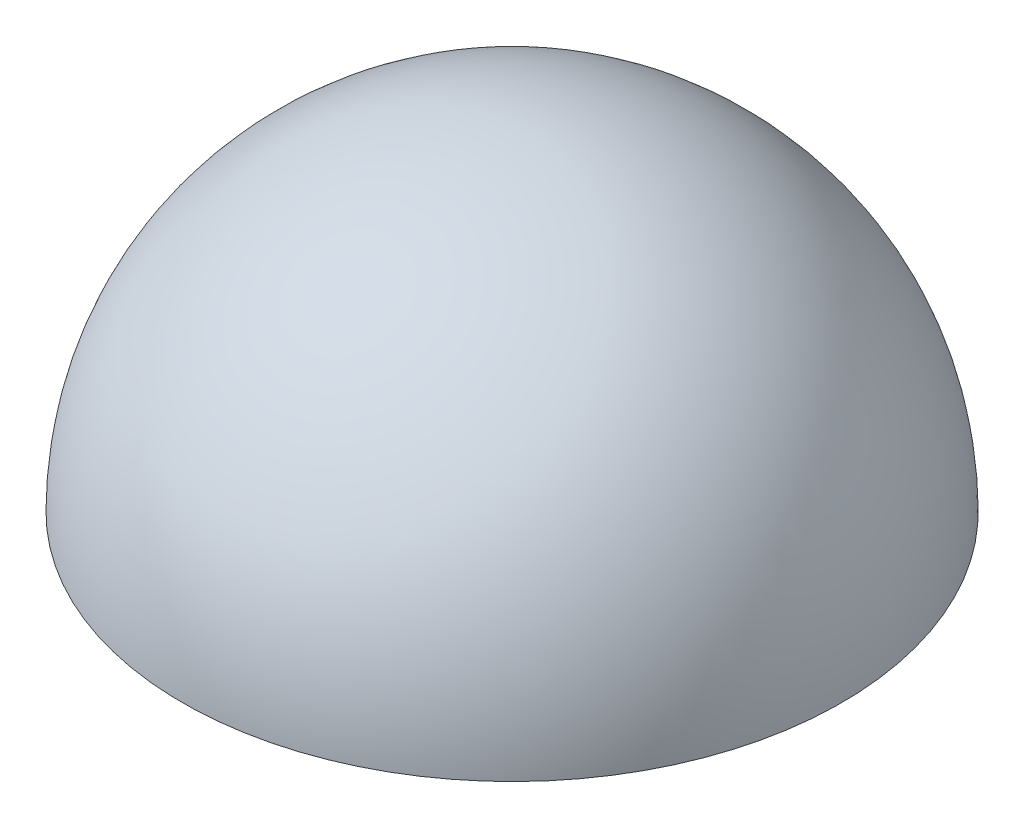
ISO-10303-21;
HEADER;
FILE_DESCRIPTION(('STEP AP214'),'2;1');
FILE_NAME('part.step','',(''),(''),'','','');
FILE_SCHEMA(('AUTOMOTIVE_DESIGN { 1 0 10303 214 1 1 1 1 }'));
ENDSEC;
DATA;
#1=APPLICATION_CONTEXT('core data for automotive mechanical design processes');
#2=APPLICATION_PROTOCOL_DEFINITION('international standard','automotive_design',2000,#1);
#3=PRODUCT_CONTEXT('',#1,'mechanical');
#4=PRODUCT('Part','Part','',(#3));
#5=PRODUCT_RELATED_PRODUCT_CATEGORY('part','',(#4));
#6=PRODUCT_DEFINITION_FORMATION('','',#4);
#7=PRODUCT_DEFINITION_CONTEXT('part definition',#1,'design');
#8=PRODUCT_DEFINITION('design','',#6,#7);
#9=PRODUCT_DEFINITION_SHAPE('','',#8);
#10=(LENGTH_UNIT() NAMED_UNIT(*) SI_UNIT(.MILLI.,.METRE.));
#11=(NAMED_UNIT(*) PLANE_ANGLE_UNIT() SI_UNIT($,.RADIAN.));
#12=(NAMED_UNIT(*) SI_UNIT($,.STERADIAN.) SOLID_ANGLE_UNIT());
#13=UNCERTAINTY_MEASURE_WITH_UNIT(LENGTH_MEASURE(1.E-05),#10,'distance_accuracy_value','');
#14=(GEOMETRIC_REPRESENTATION_CONTEXT(3) GLOBAL_UNCERTAINTY_ASSIGNED_CONTEXT((#13)) GLOBAL_UNIT_ASSIGNED_CONTEXT((#10,
#11,#12)) REPRESENTATION_CONTEXT('',''));
#15=CARTESIAN_POINT('',(0.,0.,0.));
#16=DIRECTION('',(0.,0.,1.));
#17=DIRECTION('',(1.,0.,0.));
#18=AXIS2_PLACEMENT_3D('',#15,#16,#17);
#19=CARTESIAN_POINT('',(0.,0.,0.));
#20=DIRECTION('',(-1.,0.,0.));
#21=DIRECTION('',(0.,0.,1.));
#22=AXIS2_PLACEMENT_3D('',#19,#20,#21);
#23=SPHERICAL_SURFACE('',#22,5.);
#24=CARTESIAN_POINT('',(0.,0.,0.));
#25=DIRECTION('',(0.,-1.,0.));
#26=DIRECTION('',(0.,0.,-1.));
#27=AXIS2_PLACEMENT_3D('',#24,#25,#26);
#28=SPHERICAL_SURFACE('',#27,5.);
#29=CARTESIAN_POINT('',(0.,0.,0.));
#30=DIRECTION('',(0.,-1.,0.));
#31=DIRECTION('',(0.,0.,-1.));
#32=AXIS2_PLACEMENT_3D('',#29,#30,#31);
#33=CIRCLE('',#32,5.);
#34=CARTESIAN_POINT('',(0.,0.,-5.));
#35=VERTEX_POINT('',#34);
#36=EDGE_CURVE('E10',#35,#35,#33,.T.);
#37=ORIENTED_EDGE('',*,*,#36,.F.);
#38=EDGE_LOOP('',(#37));
#39=FACE_BOUND('',#38,.T.);
#40=ADVANCED_FACE('F39',(#39),#28,.T.);
#41=CARTESIAN_POINT('',(0.,0.,0.));
#42=DIRECTION('',(0.,-1.,0.));
#43=DIRECTION('',(0.,0.,-1.));
#44=AXIS2_PLACEMENT_3D('',#41,#42,#43);
#45=PLANE('',#44);
#46=CARTESIAN_POINT('',(0.,0.,0.));
#47=DIRECTION('',(0.,1.,0.));
#48=DIRECTION('',(0.,0.,1.));
#49=AXIS2_PLACEMENT_3D('',#46,#47,#48);
#50=CIRCLE('',#49,4.5);
#51=CARTESIAN_POINT('',(0.,0.,4.5));
#52=VERTEX_POINT('',#51);
#53=EDGE_CURVE('E46',#52,#52,#50,.T.);
#54=ORIENTED_EDGE('',*,*,#53,.T.);
#55=EDGE_LOOP('',(#54));
#56=FACE_BOUND('',#55,.T.);
#57=ORIENTED_EDGE('',*,*,#36,.T.);
#58=EDGE_LOOP('',(#57));
#59=FACE_BOUND('',#58,.T.);
#60=ADVANCED_FACE('F53',(#56,#59),#45,.T.);
#61=CARTESIAN_POINT('',(0.,0.,0.));
#62=DIRECTION('',(1.,0.,0.));
#63=DIRECTION('',(0.,0.,1.));
#64=AXIS2_PLACEMENT_3D('',#61,#62,#63);
#65=SPHERICAL_SURFACE('',#64,4.5);
#66=CARTESIAN_POINT('',(0.,0.,0.));
#67=DIRECTION('',(0.,1.,0.));
#68=DIRECTION('',(0.,0.,1.));
#69=AXIS2_PLACEMENT_3D('',#66,#67,#68);
#70=SPHERICAL_SURFACE('',#69,4.5);
#71=ORIENTED_EDGE('',*,*,#53,.F.);
#72=EDGE_LOOP('',(#71));
#73=FACE_BOUND('',#72,.T.);
#74=ADVANCED_FACE('F55',(#73),#70,.F.);
#75=CLOSED_SHELL('',(#40,#60,#74));
#76=MANIFOLD_SOLID_BREP('B2',#75);
#77=ADVANCED_BREP_SHAPE_REPRESENTATION('',(#18,#76),#14);
#78=SHAPE_DEFINITION_REPRESENTATION(#9,#77);
ENDSEC;
END-ISO-10303-21;
